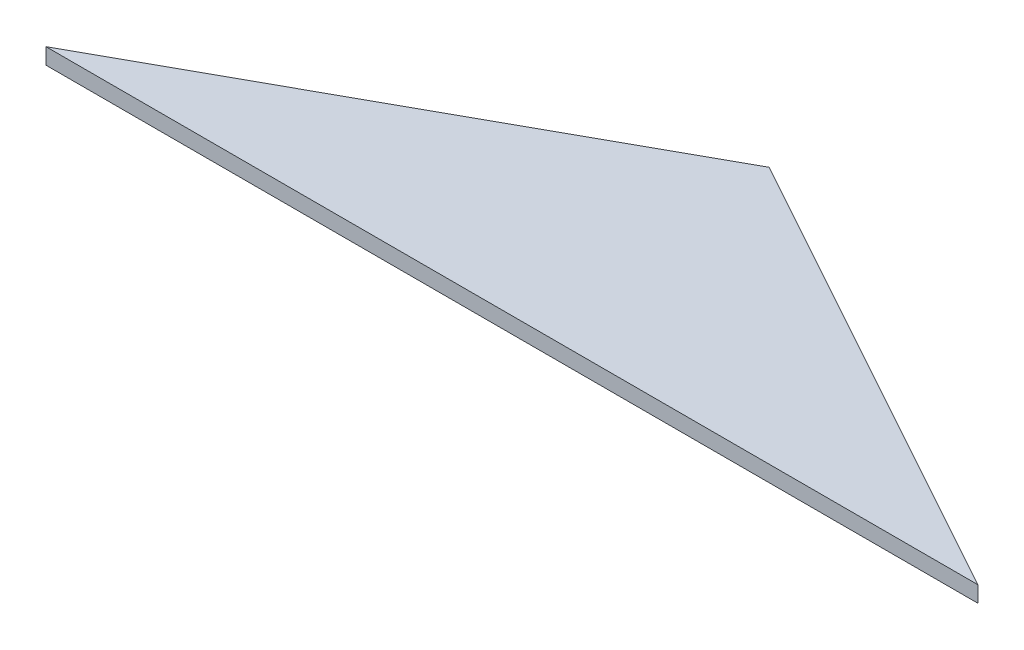
ISO-10303-21;
HEADER;
FILE_DESCRIPTION(('STEP AP214'),'2;1');
FILE_NAME('part.step','',(''),(''),'','','');
FILE_SCHEMA(('AUTOMOTIVE_DESIGN { 1 0 10303 214 1 1 1 1 }'));
ENDSEC;
DATA;
#1=APPLICATION_CONTEXT('core data for automotive mechanical design processes');
#2=APPLICATION_PROTOCOL_DEFINITION('international standard','automotive_design',2000,#1);
#3=PRODUCT_CONTEXT('',#1,'mechanical');
#4=PRODUCT('Part','Part','',(#3));
#5=PRODUCT_RELATED_PRODUCT_CATEGORY('part','',(#4));
#6=PRODUCT_DEFINITION_FORMATION('','',#4);
#7=PRODUCT_DEFINITION_CONTEXT('part definition',#1,'design');
#8=PRODUCT_DEFINITION('design','',#6,#7);
#9=PRODUCT_DEFINITION_SHAPE('','',#8);
#10=(LENGTH_UNIT() NAMED_UNIT(*) SI_UNIT(.MILLI.,.METRE.));
#11=(NAMED_UNIT(*) PLANE_ANGLE_UNIT() SI_UNIT($,.RADIAN.));
#12=(NAMED_UNIT(*) SI_UNIT($,.STERADIAN.) SOLID_ANGLE_UNIT());
#13=UNCERTAINTY_MEASURE_WITH_UNIT(LENGTH_MEASURE(1.E-05),#10,'distance_accuracy_value','');
#14=(GEOMETRIC_REPRESENTATION_CONTEXT(3) GLOBAL_UNCERTAINTY_ASSIGNED_CONTEXT((#13)) GLOBAL_UNIT_ASSIGNED_CONTEXT((#10,
#11,#12)) REPRESENTATION_CONTEXT('',''));
#15=CARTESIAN_POINT('',(0.,0.,0.));
#16=DIRECTION('',(0.,0.,1.));
#17=DIRECTION('',(1.,0.,0.));
#18=AXIS2_PLACEMENT_3D('',#15,#16,#17);
#19=CARTESIAN_POINT('',(-145.,5.,0.));
#20=DIRECTION('',(0.483077342911335,0.,0.875577684026794));
#21=DIRECTION('',(0.875577684026794,0.,-0.483077342911335));
#22=AXIS2_PLACEMENT_3D('',#19,#20,#21);
#23=PLANE('',#22);
#24=DIRECTION('',(-0.875577684026794,0.,0.483077342911335));
#25=VECTOR('',#24,1.);
#26=CARTESIAN_POINT('',(-145.,0.,0.));
#27=LINE('',#26,#25);
#28=CARTESIAN_POINT('',(0.,0.,-80.));
#29=VERTEX_POINT('',#28);
#30=CARTESIAN_POINT('',(-145.,0.,0.));
#31=VERTEX_POINT('',#30);
#32=EDGE_CURVE('E84',#29,#31,#27,.T.);
#33=ORIENTED_EDGE('',*,*,#32,.T.);
#34=DIRECTION('',(0.,-1.,0.));
#35=VECTOR('',#34,1.);
#36=CARTESIAN_POINT('',(-145.,5.,0.));
#37=LINE('',#36,#35);
#38=CARTESIAN_POINT('',(-145.,5.,0.));
#39=VERTEX_POINT('',#38);
#40=EDGE_CURVE('E11',#39,#31,#37,.T.);
#41=ORIENTED_EDGE('',*,*,#40,.F.);
#42=DIRECTION('',(-0.875577684026794,0.,0.483077342911335));
#43=VECTOR('',#42,1.);
#44=CARTESIAN_POINT('',(-145.,5.,0.));
#45=LINE('',#44,#43);
#46=CARTESIAN_POINT('',(0.,5.,-80.));
#47=VERTEX_POINT('',#46);
#48=EDGE_CURVE('E77',#47,#39,#45,.T.);
#49=ORIENTED_EDGE('',*,*,#48,.F.);
#50=DIRECTION('',(0.,-1.,0.));
#51=VECTOR('',#50,1.);
#52=CARTESIAN_POINT('',(0.,5.,-80.));
#53=LINE('',#52,#51);
#54=EDGE_CURVE('E85',#47,#29,#53,.T.);
#55=ORIENTED_EDGE('',*,*,#54,.T.);
#56=EDGE_LOOP('',(#33,#41,#49,#55));
#57=FACE_BOUND('',#56,.T.);
#58=ADVANCED_FACE('F37',(#57),#23,.F.);
#59=CARTESIAN_POINT('',(-145.,5.,0.));
#60=DIRECTION('',(0.,0.,-1.));
#61=DIRECTION('',(-1.,0.,0.));
#62=AXIS2_PLACEMENT_3D('',#59,#60,#61);
#63=PLANE('',#62);
#64=DIRECTION('',(1.,0.,0.));
#65=VECTOR('',#64,1.);
#66=CARTESIAN_POINT('',(-145.,0.,0.));
#67=LINE('',#66,#65);
#68=CARTESIAN_POINT('',(145.,0.,0.));
#69=VERTEX_POINT('',#68);
#70=EDGE_CURVE('E65',#31,#69,#67,.T.);
#71=ORIENTED_EDGE('',*,*,#70,.T.);
#72=DIRECTION('',(0.,-1.,0.));
#73=VECTOR('',#72,1.);
#74=CARTESIAN_POINT('',(145.,5.,0.));
#75=LINE('',#74,#73);
#76=CARTESIAN_POINT('',(145.,5.,0.));
#77=VERTEX_POINT('',#76);
#78=EDGE_CURVE('E45',#77,#69,#75,.T.);
#79=ORIENTED_EDGE('',*,*,#78,.F.);
#80=DIRECTION('',(1.,0.,0.));
#81=VECTOR('',#80,1.);
#82=CARTESIAN_POINT('',(-145.,5.,0.));
#83=LINE('',#82,#81);
#84=EDGE_CURVE('E73',#39,#77,#83,.T.);
#85=ORIENTED_EDGE('',*,*,#84,.F.);
#86=ORIENTED_EDGE('',*,*,#40,.T.);
#87=EDGE_LOOP('',(#71,#79,#85,#86));
#88=FACE_BOUND('',#87,.T.);
#89=ADVANCED_FACE('F74',(#88),#63,.F.);
#90=CARTESIAN_POINT('',(0.,5.,-80.));
#91=DIRECTION('',(-0.483077342911334,0.,0.875577684026794));
#92=DIRECTION('',(0.875577684026794,0.,0.483077342911334));
#93=AXIS2_PLACEMENT_3D('',#90,#91,#92);
#94=PLANE('',#93);
#95=DIRECTION('',(-0.875577684026794,0.,-0.483077342911334));
#96=VECTOR('',#95,1.);
#97=CARTESIAN_POINT('',(0.,0.,-80.));
#98=LINE('',#97,#96);
#99=EDGE_CURVE('E70',#69,#29,#98,.T.);
#100=ORIENTED_EDGE('',*,*,#99,.T.);
#101=ORIENTED_EDGE('',*,*,#54,.F.);
#102=DIRECTION('',(-0.875577684026794,0.,-0.483077342911334));
#103=VECTOR('',#102,1.);
#104=CARTESIAN_POINT('',(0.,5.,-80.));
#105=LINE('',#104,#103);
#106=EDGE_CURVE('E53',#77,#47,#105,.T.);
#107=ORIENTED_EDGE('',*,*,#106,.F.);
#108=ORIENTED_EDGE('',*,*,#78,.T.);
#109=EDGE_LOOP('',(#100,#101,#107,#108));
#110=FACE_BOUND('',#109,.T.);
#111=ADVANCED_FACE('F92',(#110),#94,.F.);
#112=CARTESIAN_POINT('',(0.,5.,0.));
#113=DIRECTION('',(0.,-1.,0.));
#114=DIRECTION('',(0.,0.,-1.));
#115=AXIS2_PLACEMENT_3D('',#112,#113,#114);
#116=PLANE('',#115);
#117=ORIENTED_EDGE('',*,*,#48,.T.);
#118=ORIENTED_EDGE('',*,*,#84,.T.);
#119=ORIENTED_EDGE('',*,*,#106,.T.);
#120=EDGE_LOOP('',(#117,#118,#119));
#121=FACE_BOUND('',#120,.T.);
#122=ADVANCED_FACE('F80',(#121),#116,.F.);
#123=CARTESIAN_POINT('',(0.,0.,0.));
#124=DIRECTION('',(0.,-1.,0.));
#125=DIRECTION('',(0.,0.,-1.));
#126=AXIS2_PLACEMENT_3D('',#123,#124,#125);
#127=PLANE('',#126);
#128=ORIENTED_EDGE('',*,*,#32,.F.);
#129=ORIENTED_EDGE('',*,*,#99,.F.);
#130=ORIENTED_EDGE('',*,*,#70,.F.);
#131=EDGE_LOOP('',(#128,#129,#130));
#132=FACE_BOUND('',#131,.T.);
#133=ADVANCED_FACE('F93',(#132),#127,.T.);
#134=CLOSED_SHELL('',(#58,#89,#111,#122,#133));
#135=MANIFOLD_SOLID_BREP('B2',#134);
#136=ADVANCED_BREP_SHAPE_REPRESENTATION('',(#18,#135),#14);
#137=SHAPE_DEFINITION_REPRESENTATION(#9,#136);
ENDSEC;
END-ISO-10303-21;
